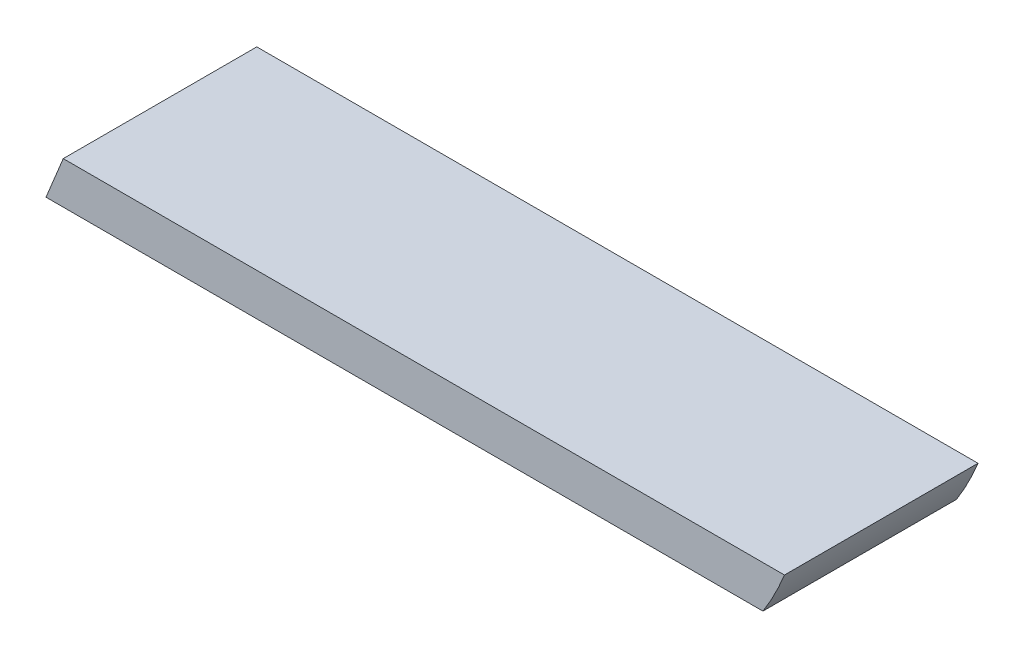
ISO-10303-21;
HEADER;
FILE_DESCRIPTION(('STEP AP214'),'2;1');
FILE_NAME('part.step','',(''),(''),'','','');
FILE_SCHEMA(('AUTOMOTIVE_DESIGN { 1 0 10303 214 1 1 1 1 }'));
ENDSEC;
DATA;
#1=APPLICATION_CONTEXT('core data for automotive mechanical design processes');
#2=APPLICATION_PROTOCOL_DEFINITION('international standard','automotive_design',2000,#1);
#3=PRODUCT_CONTEXT('',#1,'mechanical');
#4=PRODUCT('Part','Part','',(#3));
#5=PRODUCT_RELATED_PRODUCT_CATEGORY('part','',(#4));
#6=PRODUCT_DEFINITION_FORMATION('','',#4);
#7=PRODUCT_DEFINITION_CONTEXT('part definition',#1,'design');
#8=PRODUCT_DEFINITION('design','',#6,#7);
#9=PRODUCT_DEFINITION_SHAPE('','',#8);
#10=(LENGTH_UNIT() NAMED_UNIT(*) SI_UNIT(.MILLI.,.METRE.));
#11=(NAMED_UNIT(*) PLANE_ANGLE_UNIT() SI_UNIT($,.RADIAN.));
#12=(NAMED_UNIT(*) SI_UNIT($,.STERADIAN.) SOLID_ANGLE_UNIT());
#13=UNCERTAINTY_MEASURE_WITH_UNIT(LENGTH_MEASURE(1.E-05),#10,'distance_accuracy_value','');
#14=(GEOMETRIC_REPRESENTATION_CONTEXT(3) GLOBAL_UNCERTAINTY_ASSIGNED_CONTEXT((#13)) GLOBAL_UNIT_ASSIGNED_CONTEXT((#10,
#11,#12)) REPRESENTATION_CONTEXT('',''));
#15=CARTESIAN_POINT('',(0.,0.,0.));
#16=DIRECTION('',(0.,0.,1.));
#17=DIRECTION('',(1.,0.,0.));
#18=AXIS2_PLACEMENT_3D('',#15,#16,#17);
#19=CARTESIAN_POINT('',(-26.731617613674,5.934316226117,0.));
#20=DIRECTION('',(0.,-1.,0.));
#21=DIRECTION('',(1.,0.,0.));
#22=AXIS2_PLACEMENT_3D('',#19,#20,#21);
#23=PLANE('',#22);
#24=DIRECTION('',(-1.,0.,0.));
#25=VECTOR('',#24,1.);
#26=CARTESIAN_POINT('',(-26.361173490705,5.934316226117,0.));
#27=LINE('',#26,#25);
#28=CARTESIAN_POINT('',(-26.361173490705,5.934316226117,0.));
#29=VERTEX_POINT('',#28);
#30=CARTESIAN_POINT('',(-26.731617613674,5.934316226117,0.));
#31=VERTEX_POINT('',#30);
#32=EDGE_CURVE('E11',#29,#31,#27,.T.);
#33=ORIENTED_EDGE('',*,*,#32,.F.);
#34=DIRECTION('',(0.,0.,1.));
#35=VECTOR('',#34,1.);
#36=CARTESIAN_POINT('',(-26.361173490705,5.934316226117,0.));
#37=LINE('',#36,#35);
#38=CARTESIAN_POINT('',(-26.361173490705,5.934316226117,0.1));
#39=VERTEX_POINT('',#38);
#40=EDGE_CURVE('E24',#29,#39,#37,.T.);
#41=ORIENTED_EDGE('',*,*,#40,.T.);
#42=DIRECTION('',(1.,0.,0.));
#43=VECTOR('',#42,1.);
#44=CARTESIAN_POINT('',(-26.361173490705,5.934316226117,0.1));
#45=LINE('',#44,#43);
#46=CARTESIAN_POINT('',(-26.731617613674,5.934316226117,0.1));
#47=VERTEX_POINT('',#46);
#48=EDGE_CURVE('E75',#47,#39,#45,.T.);
#49=ORIENTED_EDGE('',*,*,#48,.F.);
#50=DIRECTION('',(0.,0.,1.));
#51=VECTOR('',#50,1.);
#52=CARTESIAN_POINT('',(-26.731617613674,5.934316226117,0.));
#53=LINE('',#52,#51);
#54=EDGE_CURVE('E85',#31,#47,#53,.T.);
#55=ORIENTED_EDGE('',*,*,#54,.F.);
#56=EDGE_LOOP('',(#33,#41,#49,#55));
#57=FACE_BOUND('',#56,.T.);
#58=ADVANCED_FACE('F17',(#57),#23,.T.);
#59=CARTESIAN_POINT('',(-26.72271034668,5.956045362914,0.));
#60=DIRECTION('',(-0.925276999373022,0.379292070087495,0.));
#61=DIRECTION('',(-0.379292070087495,-0.925276999373022,0.));
#62=AXIS2_PLACEMENT_3D('',#59,#60,#61);
#63=PLANE('',#62);
#64=DIRECTION('',(0.379292070087495,0.925276999373022,0.));
#65=VECTOR('',#64,1.);
#66=CARTESIAN_POINT('',(-26.731617613674,5.934316226117,0.));
#67=LINE('',#66,#65);
#68=CARTESIAN_POINT('',(-26.72271034668,5.956045362914,0.));
#69=VERTEX_POINT('',#68);
#70=EDGE_CURVE('E83',#31,#69,#67,.T.);
#71=ORIENTED_EDGE('',*,*,#70,.F.);
#72=ORIENTED_EDGE('',*,*,#54,.T.);
#73=DIRECTION('',(-0.379292070087495,-0.925276999373022,0.));
#74=VECTOR('',#73,1.);
#75=CARTESIAN_POINT('',(-26.731617613674,5.934316226117,0.1));
#76=LINE('',#75,#74);
#77=CARTESIAN_POINT('',(-26.72271034668,5.956045362914,0.1));
#78=VERTEX_POINT('',#77);
#79=EDGE_CURVE('E81',#78,#47,#76,.T.);
#80=ORIENTED_EDGE('',*,*,#79,.F.);
#81=DIRECTION('',(0.,0.,1.));
#82=VECTOR('',#81,1.);
#83=CARTESIAN_POINT('',(-26.72271034668,5.956045362914,0.));
#84=LINE('',#83,#82);
#85=EDGE_CURVE('E61',#69,#78,#84,.T.);
#86=ORIENTED_EDGE('',*,*,#85,.F.);
#87=EDGE_LOOP('',(#71,#72,#80,#86));
#88=FACE_BOUND('',#87,.T.);
#89=ADVANCED_FACE('F91',(#88),#63,.T.);
#90=CARTESIAN_POINT('',(-26.350051650386,5.956045362914,0.));
#91=DIRECTION('',(0.,1.,0.));
#92=DIRECTION('',(-1.,0.,0.));
#93=AXIS2_PLACEMENT_3D('',#90,#91,#92);
#94=PLANE('',#93);
#95=DIRECTION('',(1.,0.,0.));
#96=VECTOR('',#95,1.);
#97=CARTESIAN_POINT('',(-26.72271034668,5.956045362914,0.));
#98=LINE('',#97,#96);
#99=CARTESIAN_POINT('',(-26.350051650386,5.956045362914,0.));
#100=VERTEX_POINT('',#99);
#101=EDGE_CURVE('E65',#69,#100,#98,.T.);
#102=ORIENTED_EDGE('',*,*,#101,.F.);
#103=ORIENTED_EDGE('',*,*,#85,.T.);
#104=DIRECTION('',(-1.,0.,0.));
#105=VECTOR('',#104,1.);
#106=CARTESIAN_POINT('',(-26.72271034668,5.956045362914,0.1));
#107=LINE('',#106,#105);
#108=CARTESIAN_POINT('',(-26.350051650386,5.956045362914,0.1));
#109=VERTEX_POINT('',#108);
#110=EDGE_CURVE('E54',#109,#78,#107,.T.);
#111=ORIENTED_EDGE('',*,*,#110,.F.);
#112=DIRECTION('',(0.,0.,1.));
#113=VECTOR('',#112,1.);
#114=CARTESIAN_POINT('',(-26.350051650386,5.956045362914,0.));
#115=LINE('',#114,#113);
#116=EDGE_CURVE('E58',#100,#109,#115,.T.);
#117=ORIENTED_EDGE('',*,*,#116,.F.);
#118=EDGE_LOOP('',(#102,#103,#111,#117));
#119=FACE_BOUND('',#118,.T.);
#120=ADVANCED_FACE('F57',(#119),#94,.T.);
#121=CARTESIAN_POINT('',(-26.474240487687,6.005899301844,0.));
#122=DIRECTION('',(0.,0.,1.));
#123=DIRECTION('',(-0.844906962257827,0.534913287485225,0.));
#124=AXIS2_PLACEMENT_3D('',#121,#122,#123);
#125=CYLINDRICAL_SURFACE('',#124,0.133821831316658);
#126=CARTESIAN_POINT('',(-26.474240487687,6.005899301844,0.));
#127=DIRECTION('',(0.,0.,-1.));
#128=DIRECTION('',(-0.844906962257827,0.534913287485225,0.));
#129=AXIS2_PLACEMENT_3D('',#126,#127,#128);
#130=CIRCLE('',#129,0.133821831316658);
#131=EDGE_CURVE('E71',#100,#29,#130,.T.);
#132=ORIENTED_EDGE('',*,*,#131,.F.);
#133=ORIENTED_EDGE('',*,*,#116,.T.);
#134=CARTESIAN_POINT('',(-26.474240487687,6.005899301844,0.1));
#135=DIRECTION('',(0.,0.,1.));
#136=DIRECTION('',(-0.844906962257827,0.534913287485225,0.));
#137=AXIS2_PLACEMENT_3D('',#134,#135,#136);
#138=CIRCLE('',#137,0.133821831316658);
#139=EDGE_CURVE('E70',#39,#109,#138,.T.);
#140=ORIENTED_EDGE('',*,*,#139,.F.);
#141=ORIENTED_EDGE('',*,*,#40,.F.);
#142=EDGE_LOOP('',(#132,#133,#140,#141));
#143=FACE_BOUND('',#142,.T.);
#144=ADVANCED_FACE('F69',(#143),#125,.T.);
#145=CARTESIAN_POINT('',(-26.542585541454,5.945207491497,0.));
#146=DIRECTION('',(0.,0.,1.));
#147=DIRECTION('',(1.,0.,0.));
#148=AXIS2_PLACEMENT_3D('',#145,#146,#147);
#149=PLANE('',#148);
#150=ORIENTED_EDGE('',*,*,#131,.T.);
#151=ORIENTED_EDGE('',*,*,#32,.T.);
#152=ORIENTED_EDGE('',*,*,#70,.T.);
#153=ORIENTED_EDGE('',*,*,#101,.T.);
#154=EDGE_LOOP('',(#150,#151,#152,#153));
#155=FACE_BOUND('',#154,.T.);
#156=ADVANCED_FACE('F88',(#155),#149,.F.);
#157=CARTESIAN_POINT('',(-26.542585541454,5.945207491497,0.1));
#158=DIRECTION('',(0.,0.,1.));
#159=DIRECTION('',(1.,0.,0.));
#160=AXIS2_PLACEMENT_3D('',#157,#158,#159);
#161=PLANE('',#160);
#162=ORIENTED_EDGE('',*,*,#139,.T.);
#163=ORIENTED_EDGE('',*,*,#110,.T.);
#164=ORIENTED_EDGE('',*,*,#79,.T.);
#165=ORIENTED_EDGE('',*,*,#48,.T.);
#166=EDGE_LOOP('',(#162,#163,#164,#165));
#167=FACE_BOUND('',#166,.T.);
#168=ADVANCED_FACE('F74',(#167),#161,.T.);
#169=CLOSED_SHELL('',(#58,#89,#120,#144,#156,#168));
#170=MANIFOLD_SOLID_BREP('B1',#169);
#171=ADVANCED_BREP_SHAPE_REPRESENTATION('',(#18,#170),#14);
#172=SHAPE_DEFINITION_REPRESENTATION(#9,#171);
ENDSEC;
END-ISO-10303-21;
